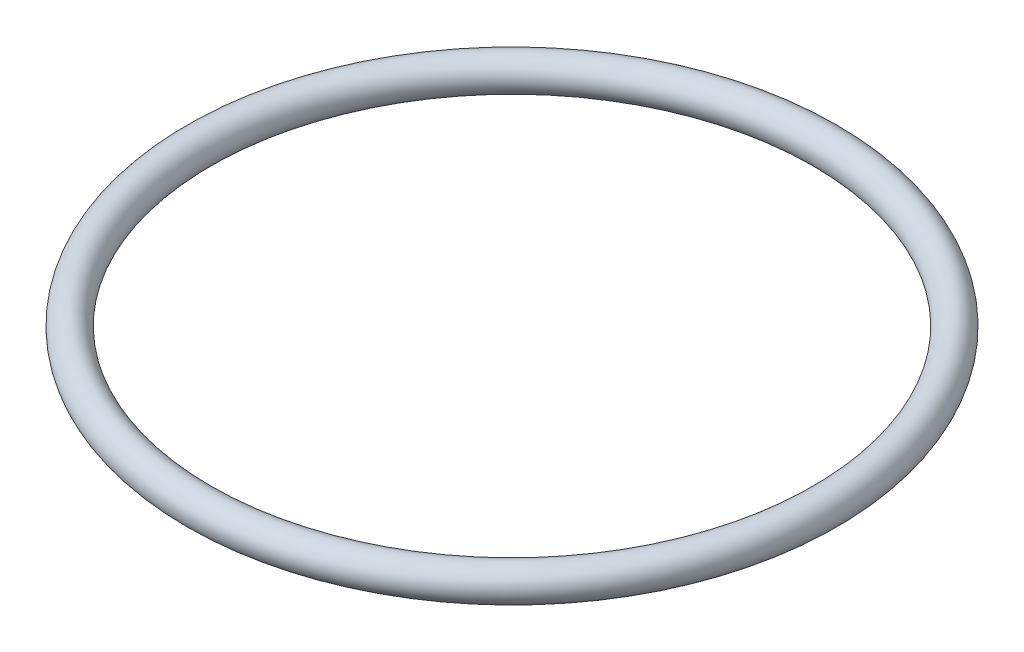
ISO-10303-21;
HEADER;
FILE_DESCRIPTION(('STEP AP214'),'2;1');
FILE_NAME('part.step','',(''),(''),'','','');
FILE_SCHEMA(('AUTOMOTIVE_DESIGN { 1 0 10303 214 1 1 1 1 }'));
ENDSEC;
DATA;
#1=APPLICATION_CONTEXT('core data for automotive mechanical design processes');
#2=APPLICATION_PROTOCOL_DEFINITION('international standard','automotive_design',2000,#1);
#3=PRODUCT_CONTEXT('',#1,'mechanical');
#4=PRODUCT('Part','Part','',(#3));
#5=PRODUCT_RELATED_PRODUCT_CATEGORY('part','',(#4));
#6=PRODUCT_DEFINITION_FORMATION('','',#4);
#7=PRODUCT_DEFINITION_CONTEXT('part definition',#1,'design');
#8=PRODUCT_DEFINITION('design','',#6,#7);
#9=PRODUCT_DEFINITION_SHAPE('','',#8);
#10=(LENGTH_UNIT() NAMED_UNIT(*) SI_UNIT(.MILLI.,.METRE.));
#11=(NAMED_UNIT(*) PLANE_ANGLE_UNIT() SI_UNIT($,.RADIAN.));
#12=(NAMED_UNIT(*) SI_UNIT($,.STERADIAN.) SOLID_ANGLE_UNIT());
#13=UNCERTAINTY_MEASURE_WITH_UNIT(LENGTH_MEASURE(1.E-05),#10,'distance_accuracy_value','');
#14=(GEOMETRIC_REPRESENTATION_CONTEXT(3) GLOBAL_UNCERTAINTY_ASSIGNED_CONTEXT((#13)) GLOBAL_UNIT_ASSIGNED_CONTEXT((#10,
#11,#12)) REPRESENTATION_CONTEXT('',''));
#15=CARTESIAN_POINT('',(0.,0.,0.));
#16=DIRECTION('',(0.,0.,1.));
#17=DIRECTION('',(1.,0.,0.));
#18=AXIS2_PLACEMENT_3D('',#15,#16,#17);
#19=CARTESIAN_POINT('',(0.,0.,0.));
#20=DIRECTION('',(0.,-1.,0.));
#21=DIRECTION('',(0.,0.,-1.));
#22=AXIS2_PLACEMENT_3D('',#19,#20,#21);
#23=TOROIDAL_SURFACE('',#22,16.6243,0.889000000000003);
#24=CARTESIAN_POINT('',(0.,0.,-17.5133));
#25=VERTEX_POINT('',#24);
#26=VERTEX_LOOP('',#25);
#27=FACE_BOUND('',#26,.T.);
#28=ADVANCED_FACE('F30',(#27),#23,.T.);
#29=CLOSED_SHELL('',(#28));
#30=MANIFOLD_SOLID_BREP('B2',#29);
#31=ADVANCED_BREP_SHAPE_REPRESENTATION('',(#18,#30),#14);
#32=SHAPE_DEFINITION_REPRESENTATION(#9,#31);
ENDSEC;
END-ISO-10303-21;
